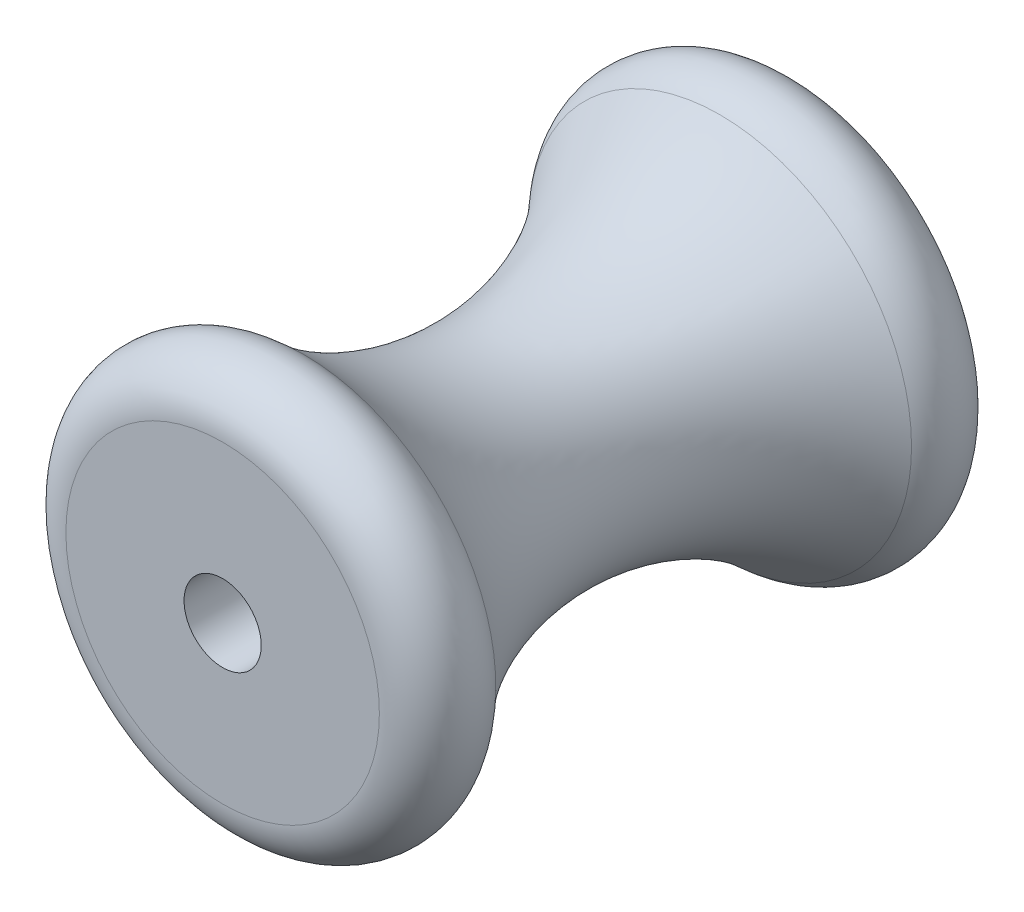
ISO-10303-21;
HEADER;
FILE_DESCRIPTION(('STEP AP214'),'2;1');
FILE_NAME('part.step','',(''),(''),'','','');
FILE_SCHEMA(('AUTOMOTIVE_DESIGN { 1 0 10303 214 1 1 1 1 }'));
ENDSEC;
DATA;
#1=APPLICATION_CONTEXT('core data for automotive mechanical design processes');
#2=APPLICATION_PROTOCOL_DEFINITION('international standard','automotive_design',2000,#1);
#3=PRODUCT_CONTEXT('',#1,'mechanical');
#4=PRODUCT('Part','Part','',(#3));
#5=PRODUCT_RELATED_PRODUCT_CATEGORY('part','',(#4));
#6=PRODUCT_DEFINITION_FORMATION('','',#4);
#7=PRODUCT_DEFINITION_CONTEXT('part definition',#1,'design');
#8=PRODUCT_DEFINITION('design','',#6,#7);
#9=PRODUCT_DEFINITION_SHAPE('','',#8);
#10=(LENGTH_UNIT() NAMED_UNIT(*) SI_UNIT(.MILLI.,.METRE.));
#11=(NAMED_UNIT(*) PLANE_ANGLE_UNIT() SI_UNIT($,.RADIAN.));
#12=(NAMED_UNIT(*) SI_UNIT($,.STERADIAN.) SOLID_ANGLE_UNIT());
#13=UNCERTAINTY_MEASURE_WITH_UNIT(LENGTH_MEASURE(1.E-05),#10,'distance_accuracy_value','');
#14=(GEOMETRIC_REPRESENTATION_CONTEXT(3) GLOBAL_UNCERTAINTY_ASSIGNED_CONTEXT((#13)) GLOBAL_UNIT_ASSIGNED_CONTEXT((#10,
#11,#12)) REPRESENTATION_CONTEXT('',''));
#15=CARTESIAN_POINT('',(0.,0.,0.));
#16=DIRECTION('',(0.,0.,1.));
#17=DIRECTION('',(1.,0.,0.));
#18=AXIS2_PLACEMENT_3D('',#15,#16,#17);
#19=CARTESIAN_POINT('',(0.,0.,-12.));
#20=DIRECTION('',(0.,0.,-1.));
#21=DIRECTION('',(0.,1.,0.));
#22=AXIS2_PLACEMENT_3D('',#19,#20,#21);
#23=PLANE('',#22);
#24=CARTESIAN_POINT('',(0.,0.,-12.));
#25=DIRECTION('',(0.,0.,-1.));
#26=DIRECTION('',(0.,1.,0.));
#27=AXIS2_PLACEMENT_3D('',#24,#25,#26);
#28=CIRCLE('',#27,6.5);
#29=CARTESIAN_POINT('',(0.,6.5,-12.));
#30=VERTEX_POINT('',#29);
#31=EDGE_CURVE('E10',#30,#30,#28,.T.);
#32=ORIENTED_EDGE('',*,*,#31,.T.);
#33=EDGE_LOOP('',(#32));
#34=FACE_BOUND('',#33,.T.);
#35=CARTESIAN_POINT('',(0.,0.,-12.));
#36=DIRECTION('',(0.,0.,-1.));
#37=DIRECTION('',(0.,1.,0.));
#38=AXIS2_PLACEMENT_3D('',#35,#36,#37);
#39=CIRCLE('',#38,1.60000000000001);
#40=CARTESIAN_POINT('',(0.,1.60000000000001,-12.));
#41=VERTEX_POINT('',#40);
#42=EDGE_CURVE('E62',#41,#41,#39,.T.);
#43=ORIENTED_EDGE('',*,*,#42,.F.);
#44=EDGE_LOOP('',(#43));
#45=FACE_BOUND('',#44,.T.);
#46=ADVANCED_FACE('F39',(#34,#45),#23,.T.);
#47=CARTESIAN_POINT('',(0.,0.,0.));
#48=DIRECTION('',(0.,0.,-1.));
#49=DIRECTION('',(0.,1.,0.));
#50=AXIS2_PLACEMENT_3D('',#47,#48,#49);
#51=TOROIDAL_SURFACE('',#50,17.,12.5);
#52=CARTESIAN_POINT('',(0.,0.,8.62068965517241));
#53=DIRECTION('',(0.,0.,-1.));
#54=DIRECTION('',(0.,1.,0.));
#55=AXIS2_PLACEMENT_3D('',#52,#53,#54);
#56=CIRCLE('',#55,7.94827586206898);
#57=CARTESIAN_POINT('',(0.,7.94827586206897,8.62068965517241));
#58=VERTEX_POINT('',#57);
#59=EDGE_CURVE('E50',#58,#58,#56,.T.);
#60=ORIENTED_EDGE('',*,*,#59,.T.);
#61=EDGE_LOOP('',(#60));
#62=FACE_BOUND('',#61,.T.);
#63=CARTESIAN_POINT('',(0.,0.,-8.62068965517242));
#64=DIRECTION('',(0.,0.,1.));
#65=DIRECTION('',(0.,-1.,0.));
#66=AXIS2_PLACEMENT_3D('',#63,#64,#65);
#67=CIRCLE('',#66,7.94827586206897);
#68=CARTESIAN_POINT('',(0.,-7.94827586206897,-8.62068965517242));
#69=VERTEX_POINT('',#68);
#70=EDGE_CURVE('E54',#69,#69,#67,.T.);
#71=ORIENTED_EDGE('',*,*,#70,.T.);
#72=EDGE_LOOP('',(#71));
#73=FACE_BOUND('',#72,.T.);
#74=ADVANCED_FACE('F69',(#62,#73),#51,.F.);
#75=CARTESIAN_POINT('',(0.,0.,12.));
#76=DIRECTION('',(0.,0.,-1.));
#77=DIRECTION('',(0.,1.,0.));
#78=AXIS2_PLACEMENT_3D('',#75,#76,#77);
#79=PLANE('',#78);
#80=CARTESIAN_POINT('',(0.,0.,12.));
#81=DIRECTION('',(0.,0.,-1.));
#82=DIRECTION('',(0.,1.,0.));
#83=AXIS2_PLACEMENT_3D('',#80,#81,#82);
#84=CIRCLE('',#83,6.50000000000001);
#85=CARTESIAN_POINT('',(0.,6.5,12.));
#86=VERTEX_POINT('',#85);
#87=EDGE_CURVE('E46',#86,#86,#84,.F.);
#88=ORIENTED_EDGE('',*,*,#87,.T.);
#89=EDGE_LOOP('',(#88));
#90=FACE_BOUND('',#89,.T.);
#91=CARTESIAN_POINT('',(0.,0.,12.));
#92=DIRECTION('',(0.,0.,-1.));
#93=DIRECTION('',(0.,1.,0.));
#94=AXIS2_PLACEMENT_3D('',#91,#92,#93);
#95=CIRCLE('',#94,1.60000000000001);
#96=CARTESIAN_POINT('',(0.,1.6,12.));
#97=VERTEX_POINT('',#96);
#98=EDGE_CURVE('E59',#97,#97,#95,.T.);
#99=ORIENTED_EDGE('',*,*,#98,.T.);
#100=EDGE_LOOP('',(#99));
#101=FACE_BOUND('',#100,.T.);
#102=ADVANCED_FACE('F75',(#90,#101),#79,.F.);
#103=CARTESIAN_POINT('',(0.,0.,-12.5));
#104=DIRECTION('',(0.,0.,-1.));
#105=DIRECTION('',(0.,1.,0.));
#106=AXIS2_PLACEMENT_3D('',#103,#104,#105);
#107=CYLINDRICAL_SURFACE('',#106,1.60000000000001);
#108=ORIENTED_EDGE('',*,*,#98,.F.);
#109=EDGE_LOOP('',(#108));
#110=FACE_BOUND('',#109,.T.);
#111=ORIENTED_EDGE('',*,*,#42,.T.);
#112=EDGE_LOOP('',(#111));
#113=FACE_BOUND('',#112,.T.);
#114=ADVANCED_FACE('F66',(#110,#113),#107,.F.);
#115=CARTESIAN_POINT('',(0.,0.,10.));
#116=DIRECTION('',(0.,0.,1.));
#117=DIRECTION('',(0.,-1.,0.));
#118=AXIS2_PLACEMENT_3D('',#115,#116,#117);
#119=TOROIDAL_SURFACE('',#118,6.50000000000001,2.);
#120=ORIENTED_EDGE('',*,*,#87,.F.);
#121=EDGE_LOOP('',(#120));
#122=FACE_BOUND('',#121,.T.);
#123=ORIENTED_EDGE('',*,*,#59,.F.);
#124=EDGE_LOOP('',(#123));
#125=FACE_BOUND('',#124,.T.);
#126=ADVANCED_FACE('F79',(#122,#125),#119,.T.);
#127=CARTESIAN_POINT('',(0.,0.,-10.));
#128=DIRECTION('',(0.,0.,1.));
#129=DIRECTION('',(0.,-1.,0.));
#130=AXIS2_PLACEMENT_3D('',#127,#128,#129);
#131=TOROIDAL_SURFACE('',#130,6.5,2.);
#132=ORIENTED_EDGE('',*,*,#70,.F.);
#133=EDGE_LOOP('',(#132));
#134=FACE_BOUND('',#133,.T.);
#135=ORIENTED_EDGE('',*,*,#31,.F.);
#136=EDGE_LOOP('',(#135));
#137=FACE_BOUND('',#136,.T.);
#138=ADVANCED_FACE('F41',(#134,#137),#131,.T.);
#139=CLOSED_SHELL('',(#46,#74,#102,#114,#126,#138));
#140=MANIFOLD_SOLID_BREP('B2',#139);
#141=ADVANCED_BREP_SHAPE_REPRESENTATION('',(#18,#140),#14);
#142=SHAPE_DEFINITION_REPRESENTATION(#9,#141);
ENDSEC;
END-ISO-10303-21;
